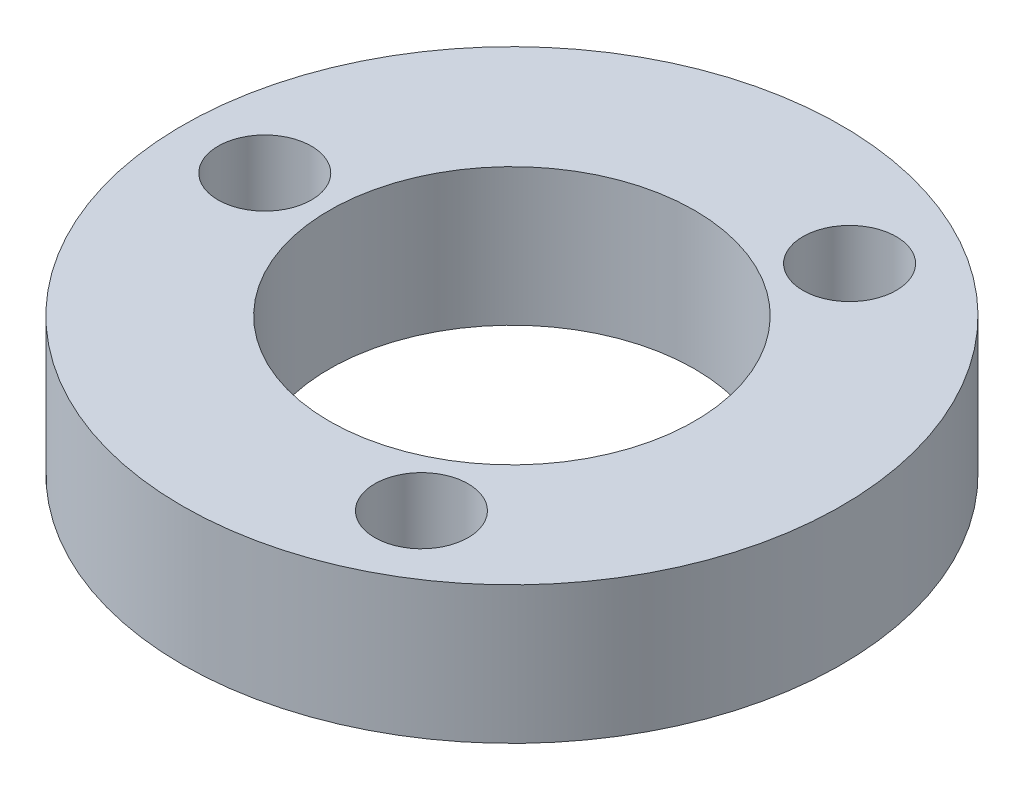
ISO-10303-21;
HEADER;
FILE_DESCRIPTION(('STEP AP214'),'2;1');
FILE_NAME('part.step','',(''),(''),'','','');
FILE_SCHEMA(('AUTOMOTIVE_DESIGN { 1 0 10303 214 1 1 1 1 }'));
ENDSEC;
DATA;
#1=APPLICATION_CONTEXT('core data for automotive mechanical design processes');
#2=APPLICATION_PROTOCOL_DEFINITION('international standard','automotive_design',2000,#1);
#3=PRODUCT_CONTEXT('',#1,'mechanical');
#4=PRODUCT('Part','Part','',(#3));
#5=PRODUCT_RELATED_PRODUCT_CATEGORY('part','',(#4));
#6=PRODUCT_DEFINITION_FORMATION('','',#4);
#7=PRODUCT_DEFINITION_CONTEXT('part definition',#1,'design');
#8=PRODUCT_DEFINITION('design','',#6,#7);
#9=PRODUCT_DEFINITION_SHAPE('','',#8);
#10=(LENGTH_UNIT() NAMED_UNIT(*) SI_UNIT(.MILLI.,.METRE.));
#11=(NAMED_UNIT(*) PLANE_ANGLE_UNIT() SI_UNIT($,.RADIAN.));
#12=(NAMED_UNIT(*) SI_UNIT($,.STERADIAN.) SOLID_ANGLE_UNIT());
#13=UNCERTAINTY_MEASURE_WITH_UNIT(LENGTH_MEASURE(1.E-05),#10,'distance_accuracy_value','');
#14=(GEOMETRIC_REPRESENTATION_CONTEXT(3) GLOBAL_UNCERTAINTY_ASSIGNED_CONTEXT((#13)) GLOBAL_UNIT_ASSIGNED_CONTEXT((#10,
#11,#12)) REPRESENTATION_CONTEXT('',''));
#15=CARTESIAN_POINT('',(0.,0.,0.));
#16=DIRECTION('',(0.,0.,1.));
#17=DIRECTION('',(1.,0.,0.));
#18=AXIS2_PLACEMENT_3D('',#15,#16,#17);
#19=CARTESIAN_POINT('',(0.,5.,0.));
#20=DIRECTION('',(0.,1.,0.));
#21=DIRECTION('',(0.,0.,1.));
#22=AXIS2_PLACEMENT_3D('',#19,#20,#21);
#23=PLANE('',#22);
#24=CARTESIAN_POINT('',(4.50000000000003,5.,-7.79422863405993));
#25=DIRECTION('',(0.,1.,0.));
#26=DIRECTION('',(0.,0.,1.));
#27=AXIS2_PLACEMENT_3D('',#24,#25,#26);
#28=CIRCLE('',#27,1.7);
#29=CARTESIAN_POINT('',(4.50000000000003,5.,-6.09422863405993));
#30=VERTEX_POINT('',#29);
#31=EDGE_CURVE('E55',#30,#30,#28,.T.);
#32=ORIENTED_EDGE('',*,*,#31,.F.);
#33=EDGE_LOOP('',(#32));
#34=FACE_BOUND('',#33,.T.);
#35=CARTESIAN_POINT('',(0.,5.,0.));
#36=DIRECTION('',(0.,1.,0.));
#37=DIRECTION('',(0.,0.,1.));
#38=AXIS2_PLACEMENT_3D('',#35,#36,#37);
#39=CIRCLE('',#38,6.65);
#40=CARTESIAN_POINT('',(0.,5.,6.65));
#41=VERTEX_POINT('',#40);
#42=EDGE_CURVE('E44',#41,#41,#39,.T.);
#43=ORIENTED_EDGE('',*,*,#42,.F.);
#44=EDGE_LOOP('',(#43));
#45=FACE_BOUND('',#44,.T.);
#46=CARTESIAN_POINT('',(0.,5.,0.));
#47=DIRECTION('',(0.,1.,0.));
#48=DIRECTION('',(0.,0.,1.));
#49=AXIS2_PLACEMENT_3D('',#46,#47,#48);
#50=CIRCLE('',#49,12.);
#51=CARTESIAN_POINT('',(0.,5.,12.));
#52=VERTEX_POINT('',#51);
#53=EDGE_CURVE('E10',#52,#52,#50,.T.);
#54=ORIENTED_EDGE('',*,*,#53,.T.);
#55=EDGE_LOOP('',(#54));
#56=FACE_BOUND('',#55,.T.);
#57=CARTESIAN_POINT('',(-9.,5.,0.));
#58=DIRECTION('',(0.,1.,0.));
#59=DIRECTION('',(0.,0.,1.));
#60=AXIS2_PLACEMENT_3D('',#57,#58,#59);
#61=CIRCLE('',#60,1.7);
#62=CARTESIAN_POINT('',(-9.,5.,1.7));
#63=VERTEX_POINT('',#62);
#64=EDGE_CURVE('E49',#63,#63,#61,.T.);
#65=ORIENTED_EDGE('',*,*,#64,.F.);
#66=EDGE_LOOP('',(#65));
#67=FACE_BOUND('',#66,.T.);
#68=CARTESIAN_POINT('',(4.49999999999993,5.,7.79422863405999));
#69=DIRECTION('',(0.,1.,0.));
#70=DIRECTION('',(0.,0.,1.));
#71=AXIS2_PLACEMENT_3D('',#68,#69,#70);
#72=CIRCLE('',#71,1.7);
#73=CARTESIAN_POINT('',(4.49999999999993,5.,9.49422863405999));
#74=VERTEX_POINT('',#73);
#75=EDGE_CURVE('E61',#74,#74,#72,.T.);
#76=ORIENTED_EDGE('',*,*,#75,.F.);
#77=EDGE_LOOP('',(#76));
#78=FACE_BOUND('',#77,.T.);
#79=ADVANCED_FACE('F33',(#34,#45,#56,#67,#78),#23,.T.);
#80=CARTESIAN_POINT('',(0.,0.,0.));
#81=DIRECTION('',(0.,1.,0.));
#82=DIRECTION('',(0.,0.,1.));
#83=AXIS2_PLACEMENT_3D('',#80,#81,#82);
#84=PLANE('',#83);
#85=CARTESIAN_POINT('',(0.,0.,0.));
#86=DIRECTION('',(0.,1.,0.));
#87=DIRECTION('',(0.,0.,1.));
#88=AXIS2_PLACEMENT_3D('',#85,#86,#87);
#89=CIRCLE('',#88,12.);
#90=CARTESIAN_POINT('',(0.,0.,12.));
#91=VERTEX_POINT('',#90);
#92=EDGE_CURVE('E37',#91,#91,#89,.T.);
#93=ORIENTED_EDGE('',*,*,#92,.F.);
#94=EDGE_LOOP('',(#93));
#95=FACE_BOUND('',#94,.T.);
#96=CARTESIAN_POINT('',(0.,0.,0.));
#97=DIRECTION('',(0.,1.,0.));
#98=DIRECTION('',(0.,0.,1.));
#99=AXIS2_PLACEMENT_3D('',#96,#97,#98);
#100=CIRCLE('',#99,6.65);
#101=CARTESIAN_POINT('',(0.,0.,6.65));
#102=VERTEX_POINT('',#101);
#103=EDGE_CURVE('E46',#102,#102,#100,.T.);
#104=ORIENTED_EDGE('',*,*,#103,.T.);
#105=EDGE_LOOP('',(#104));
#106=FACE_BOUND('',#105,.T.);
#107=CARTESIAN_POINT('',(-9.,0.,0.));
#108=DIRECTION('',(0.,1.,0.));
#109=DIRECTION('',(0.,0.,1.));
#110=AXIS2_PLACEMENT_3D('',#107,#108,#109);
#111=CIRCLE('',#110,1.7);
#112=CARTESIAN_POINT('',(-9.,0.,1.7));
#113=VERTEX_POINT('',#112);
#114=EDGE_CURVE('E52',#113,#113,#111,.T.);
#115=ORIENTED_EDGE('',*,*,#114,.T.);
#116=EDGE_LOOP('',(#115));
#117=FACE_BOUND('',#116,.T.);
#118=CARTESIAN_POINT('',(4.50000000000003,0.,-7.79422863405993));
#119=DIRECTION('',(0.,1.,0.));
#120=DIRECTION('',(0.,0.,1.));
#121=AXIS2_PLACEMENT_3D('',#118,#119,#120);
#122=CIRCLE('',#121,1.7);
#123=CARTESIAN_POINT('',(4.50000000000003,0.,-6.09422863405993));
#124=VERTEX_POINT('',#123);
#125=EDGE_CURVE('E58',#124,#124,#122,.T.);
#126=ORIENTED_EDGE('',*,*,#125,.T.);
#127=EDGE_LOOP('',(#126));
#128=FACE_BOUND('',#127,.T.);
#129=CARTESIAN_POINT('',(4.49999999999993,0.,7.79422863405999));
#130=DIRECTION('',(0.,1.,0.));
#131=DIRECTION('',(0.,0.,1.));
#132=AXIS2_PLACEMENT_3D('',#129,#130,#131);
#133=CIRCLE('',#132,1.7);
#134=CARTESIAN_POINT('',(4.49999999999993,0.,9.49422863405999));
#135=VERTEX_POINT('',#134);
#136=EDGE_CURVE('E64',#135,#135,#133,.T.);
#137=ORIENTED_EDGE('',*,*,#136,.T.);
#138=EDGE_LOOP('',(#137));
#139=FACE_BOUND('',#138,.T.);
#140=ADVANCED_FACE('F74',(#95,#106,#117,#128,#139),#84,.F.);
#141=CARTESIAN_POINT('',(0.,5.,0.));
#142=DIRECTION('',(0.,-1.,0.));
#143=DIRECTION('',(0.,0.,-1.));
#144=AXIS2_PLACEMENT_3D('',#141,#142,#143);
#145=CYLINDRICAL_SURFACE('',#144,12.);
#146=ORIENTED_EDGE('',*,*,#53,.F.);
#147=EDGE_LOOP('',(#146));
#148=FACE_BOUND('',#147,.T.);
#149=ORIENTED_EDGE('',*,*,#92,.T.);
#150=EDGE_LOOP('',(#149));
#151=FACE_BOUND('',#150,.T.);
#152=ADVANCED_FACE('F35',(#148,#151),#145,.T.);
#153=CARTESIAN_POINT('',(0.,5.,0.));
#154=DIRECTION('',(0.,-1.,0.));
#155=DIRECTION('',(0.,0.,-1.));
#156=AXIS2_PLACEMENT_3D('',#153,#154,#155);
#157=CYLINDRICAL_SURFACE('',#156,6.65);
#158=ORIENTED_EDGE('',*,*,#42,.T.);
#159=EDGE_LOOP('',(#158));
#160=FACE_BOUND('',#159,.T.);
#161=ORIENTED_EDGE('',*,*,#103,.F.);
#162=EDGE_LOOP('',(#161));
#163=FACE_BOUND('',#162,.T.);
#164=ADVANCED_FACE('F84',(#160,#163),#157,.F.);
#165=CARTESIAN_POINT('',(-9.,5.,0.));
#166=DIRECTION('',(0.,-1.,0.));
#167=DIRECTION('',(0.,0.,-1.));
#168=AXIS2_PLACEMENT_3D('',#165,#166,#167);
#169=CYLINDRICAL_SURFACE('',#168,1.7);
#170=ORIENTED_EDGE('',*,*,#64,.T.);
#171=EDGE_LOOP('',(#170));
#172=FACE_BOUND('',#171,.T.);
#173=ORIENTED_EDGE('',*,*,#114,.F.);
#174=EDGE_LOOP('',(#173));
#175=FACE_BOUND('',#174,.T.);
#176=ADVANCED_FACE('F87',(#172,#175),#169,.F.);
#177=CARTESIAN_POINT('',(4.50000000000003,5.,-7.79422863405993));
#178=DIRECTION('',(0.,-1.,0.));
#179=DIRECTION('',(0.,0.,-1.));
#180=AXIS2_PLACEMENT_3D('',#177,#178,#179);
#181=CYLINDRICAL_SURFACE('',#180,1.7);
#182=ORIENTED_EDGE('',*,*,#31,.T.);
#183=EDGE_LOOP('',(#182));
#184=FACE_BOUND('',#183,.T.);
#185=ORIENTED_EDGE('',*,*,#125,.F.);
#186=EDGE_LOOP('',(#185));
#187=FACE_BOUND('',#186,.T.);
#188=ADVANCED_FACE('F91',(#184,#187),#181,.F.);
#189=CARTESIAN_POINT('',(4.49999999999993,5.,7.79422863405999));
#190=DIRECTION('',(0.,-1.,0.));
#191=DIRECTION('',(0.,0.,-1.));
#192=AXIS2_PLACEMENT_3D('',#189,#190,#191);
#193=CYLINDRICAL_SURFACE('',#192,1.7);
#194=ORIENTED_EDGE('',*,*,#75,.T.);
#195=EDGE_LOOP('',(#194));
#196=FACE_BOUND('',#195,.T.);
#197=ORIENTED_EDGE('',*,*,#136,.F.);
#198=EDGE_LOOP('',(#197));
#199=FACE_BOUND('',#198,.T.);
#200=ADVANCED_FACE('F70',(#196,#199),#193,.F.);
#201=CLOSED_SHELL('',(#79,#140,#152,#164,#176,#188,#200));
#202=MANIFOLD_SOLID_BREP('B2',#201);
#203=ADVANCED_BREP_SHAPE_REPRESENTATION('',(#18,#202),#14);
#204=SHAPE_DEFINITION_REPRESENTATION(#9,#203);
ENDSEC;
END-ISO-10303-21;
